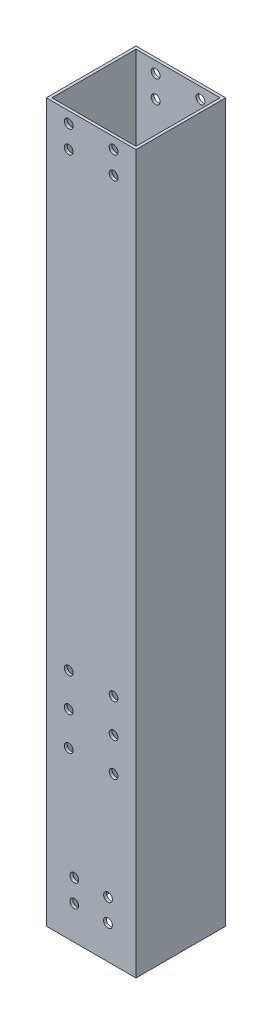
ISO-10303-21;
HEADER;
FILE_DESCRIPTION(('STEP AP214'),'2;1');
FILE_NAME('part.step','',(''),(''),'','','');
FILE_SCHEMA(('AUTOMOTIVE_DESIGN { 1 0 10303 214 1 1 1 1 }'));
ENDSEC;
DATA;
#1=APPLICATION_CONTEXT('core data for automotive mechanical design processes');
#2=APPLICATION_PROTOCOL_DEFINITION('international standard','automotive_design',2000,#1);
#3=PRODUCT_CONTEXT('',#1,'mechanical');
#4=PRODUCT('Part','Part','',(#3));
#5=PRODUCT_RELATED_PRODUCT_CATEGORY('part','',(#4));
#6=PRODUCT_DEFINITION_FORMATION('','',#4);
#7=PRODUCT_DEFINITION_CONTEXT('part definition',#1,'design');
#8=PRODUCT_DEFINITION('design','',#6,#7);
#9=PRODUCT_DEFINITION_SHAPE('','',#8);
#10=(LENGTH_UNIT() NAMED_UNIT(*) SI_UNIT(.MILLI.,.METRE.));
#11=(NAMED_UNIT(*) PLANE_ANGLE_UNIT() SI_UNIT($,.RADIAN.));
#12=(NAMED_UNIT(*) SI_UNIT($,.STERADIAN.) SOLID_ANGLE_UNIT());
#13=UNCERTAINTY_MEASURE_WITH_UNIT(LENGTH_MEASURE(1.E-05),#10,'distance_accuracy_value','');
#14=(GEOMETRIC_REPRESENTATION_CONTEXT(3) GLOBAL_UNCERTAINTY_ASSIGNED_CONTEXT((#13)) GLOBAL_UNIT_ASSIGNED_CONTEXT((#10,
#11,#12)) REPRESENTATION_CONTEXT('',''));
#15=CARTESIAN_POINT('',(0.,0.,0.));
#16=DIRECTION('',(0.,0.,1.));
#17=DIRECTION('',(1.,0.,0.));
#18=AXIS2_PLACEMENT_3D('',#15,#16,#17);
#19=CARTESIAN_POINT('',(0.,406.4,0.));
#20=DIRECTION('',(0.,-1.,0.));
#21=DIRECTION('',(0.,0.,-1.));
#22=AXIS2_PLACEMENT_3D('',#19,#20,#21);
#23=PLANE('',#22);
#24=DIRECTION('',(0.,0.,1.));
#25=VECTOR('',#24,1.);
#26=CARTESIAN_POINT('',(0.,406.4,0.));
#27=LINE('',#26,#25);
#28=CARTESIAN_POINT('',(0.,406.4,-50.8));
#29=VERTEX_POINT('',#28);
#30=CARTESIAN_POINT('',(0.,406.4,0.));
#31=VERTEX_POINT('',#30);
#32=EDGE_CURVE('E137',#29,#31,#27,.T.);
#33=ORIENTED_EDGE('',*,*,#32,.T.);
#34=DIRECTION('',(1.,0.,0.));
#35=VECTOR('',#34,1.);
#36=CARTESIAN_POINT('',(0.,406.4,0.));
#37=LINE('',#36,#35);
#38=CARTESIAN_POINT('',(50.8,406.4,0.));
#39=VERTEX_POINT('',#38);
#40=EDGE_CURVE('E140',#31,#39,#37,.T.);
#41=ORIENTED_EDGE('',*,*,#40,.T.);
#42=DIRECTION('',(0.,0.,-1.));
#43=VECTOR('',#42,1.);
#44=CARTESIAN_POINT('',(50.8,406.4,0.));
#45=LINE('',#44,#43);
#46=CARTESIAN_POINT('',(50.8,406.4,-50.8));
#47=VERTEX_POINT('',#46);
#48=EDGE_CURVE('E143',#39,#47,#45,.T.);
#49=ORIENTED_EDGE('',*,*,#48,.T.);
#50=DIRECTION('',(-1.,0.,0.));
#51=VECTOR('',#50,1.);
#52=CARTESIAN_POINT('',(0.,406.4,-50.8));
#53=LINE('',#52,#51);
#54=EDGE_CURVE('E145',#47,#29,#53,.T.);
#55=ORIENTED_EDGE('',*,*,#54,.T.);
#56=EDGE_LOOP('',(#33,#41,#49,#55));
#57=FACE_BOUND('',#56,.T.);
#58=DIRECTION('',(0.,0.,1.));
#59=VECTOR('',#58,1.);
#60=CARTESIAN_POINT('',(1.5875,406.4,0.));
#61=LINE('',#60,#59);
#62=CARTESIAN_POINT('',(1.5875,406.4,-49.2125));
#63=VERTEX_POINT('',#62);
#64=CARTESIAN_POINT('',(1.5875,406.4,-1.5875));
#65=VERTEX_POINT('',#64);
#66=EDGE_CURVE('E125',#63,#65,#61,.T.);
#67=ORIENTED_EDGE('',*,*,#66,.F.);
#68=DIRECTION('',(-1.,0.,0.));
#69=VECTOR('',#68,1.);
#70=CARTESIAN_POINT('',(0.,406.4,-49.2125));
#71=LINE('',#70,#69);
#72=CARTESIAN_POINT('',(49.2125,406.4,-49.2125));
#73=VERTEX_POINT('',#72);
#74=EDGE_CURVE('E109',#73,#63,#71,.T.);
#75=ORIENTED_EDGE('',*,*,#74,.F.);
#76=DIRECTION('',(0.,0.,-1.));
#77=VECTOR('',#76,1.);
#78=CARTESIAN_POINT('',(49.2125,406.4,0.));
#79=LINE('',#78,#77);
#80=CARTESIAN_POINT('',(49.2125,406.4,-1.5875));
#81=VERTEX_POINT('',#80);
#82=EDGE_CURVE('E134',#81,#73,#79,.T.);
#83=ORIENTED_EDGE('',*,*,#82,.F.);
#84=DIRECTION('',(1.,0.,0.));
#85=VECTOR('',#84,1.);
#86=CARTESIAN_POINT('',(0.,406.4,-1.5875));
#87=LINE('',#86,#85);
#88=EDGE_CURVE('E127',#65,#81,#87,.T.);
#89=ORIENTED_EDGE('',*,*,#88,.F.);
#90=EDGE_LOOP('',(#67,#75,#83,#89));
#91=FACE_BOUND('',#90,.T.);
#92=ADVANCED_FACE('F37',(#57,#91),#23,.F.);
#93=CARTESIAN_POINT('',(0.,0.,0.));
#94=DIRECTION('',(0.,-1.,0.));
#95=DIRECTION('',(0.,0.,-1.));
#96=AXIS2_PLACEMENT_3D('',#93,#94,#95);
#97=PLANE('',#96);
#98=DIRECTION('',(0.,0.,1.));
#99=VECTOR('',#98,1.);
#100=CARTESIAN_POINT('',(0.,0.,0.));
#101=LINE('',#100,#99);
#102=CARTESIAN_POINT('',(0.,0.,-50.8));
#103=VERTEX_POINT('',#102);
#104=CARTESIAN_POINT('',(0.,0.,0.));
#105=VERTEX_POINT('',#104);
#106=EDGE_CURVE('E148',#103,#105,#101,.T.);
#107=ORIENTED_EDGE('',*,*,#106,.F.);
#108=DIRECTION('',(-1.,0.,0.));
#109=VECTOR('',#108,1.);
#110=CARTESIAN_POINT('',(0.,0.,-50.8));
#111=LINE('',#110,#109);
#112=CARTESIAN_POINT('',(50.8,0.,-50.8));
#113=VERTEX_POINT('',#112);
#114=EDGE_CURVE('E141',#113,#103,#111,.T.);
#115=ORIENTED_EDGE('',*,*,#114,.F.);
#116=DIRECTION('',(0.,0.,-1.));
#117=VECTOR('',#116,1.);
#118=CARTESIAN_POINT('',(50.8,0.,0.));
#119=LINE('',#118,#117);
#120=CARTESIAN_POINT('',(50.8,0.,0.));
#121=VERTEX_POINT('',#120);
#122=EDGE_CURVE('E153',#121,#113,#119,.T.);
#123=ORIENTED_EDGE('',*,*,#122,.F.);
#124=DIRECTION('',(1.,0.,0.));
#125=VECTOR('',#124,1.);
#126=CARTESIAN_POINT('',(0.,0.,0.));
#127=LINE('',#126,#125);
#128=EDGE_CURVE('E151',#105,#121,#127,.T.);
#129=ORIENTED_EDGE('',*,*,#128,.F.);
#130=EDGE_LOOP('',(#107,#115,#123,#129));
#131=FACE_BOUND('',#130,.T.);
#132=DIRECTION('',(-1.,0.,0.));
#133=VECTOR('',#132,1.);
#134=CARTESIAN_POINT('',(0.,0.,-49.2125));
#135=LINE('',#134,#133);
#136=CARTESIAN_POINT('',(49.2125,0.,-49.2125));
#137=VERTEX_POINT('',#136);
#138=CARTESIAN_POINT('',(1.5875,0.,-49.2125));
#139=VERTEX_POINT('',#138);
#140=EDGE_CURVE('E107',#137,#139,#135,.T.);
#141=ORIENTED_EDGE('',*,*,#140,.T.);
#142=DIRECTION('',(0.,0.,1.));
#143=VECTOR('',#142,1.);
#144=CARTESIAN_POINT('',(1.5875,0.,0.));
#145=LINE('',#144,#143);
#146=CARTESIAN_POINT('',(1.5875,0.,-1.5875));
#147=VERTEX_POINT('',#146);
#148=EDGE_CURVE('E115',#139,#147,#145,.T.);
#149=ORIENTED_EDGE('',*,*,#148,.T.);
#150=DIRECTION('',(1.,0.,0.));
#151=VECTOR('',#150,1.);
#152=CARTESIAN_POINT('',(0.,0.,-1.5875));
#153=LINE('',#152,#151);
#154=CARTESIAN_POINT('',(49.2125,0.,-1.5875));
#155=VERTEX_POINT('',#154);
#156=EDGE_CURVE('E121',#147,#155,#153,.T.);
#157=ORIENTED_EDGE('',*,*,#156,.T.);
#158=DIRECTION('',(0.,0.,-1.));
#159=VECTOR('',#158,1.);
#160=CARTESIAN_POINT('',(49.2125,0.,0.));
#161=LINE('',#160,#159);
#162=EDGE_CURVE('E61',#155,#137,#161,.T.);
#163=ORIENTED_EDGE('',*,*,#162,.T.);
#164=EDGE_LOOP('',(#141,#149,#157,#163));
#165=FACE_BOUND('',#164,.T.);
#166=ADVANCED_FACE('F124',(#131,#165),#97,.T.);
#167=CARTESIAN_POINT('',(0.,406.4,0.));
#168=DIRECTION('',(1.,0.,0.));
#169=DIRECTION('',(0.,0.,-1.));
#170=AXIS2_PLACEMENT_3D('',#167,#168,#169);
#171=PLANE('',#170);
#172=ORIENTED_EDGE('',*,*,#106,.T.);
#173=DIRECTION('',(0.,-1.,0.));
#174=VECTOR('',#173,1.);
#175=CARTESIAN_POINT('',(0.,406.4,0.));
#176=LINE('',#175,#174);
#177=EDGE_CURVE('E11',#31,#105,#176,.T.);
#178=ORIENTED_EDGE('',*,*,#177,.F.);
#179=ORIENTED_EDGE('',*,*,#32,.F.);
#180=DIRECTION('',(0.,-1.,0.));
#181=VECTOR('',#180,1.);
#182=CARTESIAN_POINT('',(0.,406.4,-50.8));
#183=LINE('',#182,#181);
#184=EDGE_CURVE('E147',#29,#103,#183,.T.);
#185=ORIENTED_EDGE('',*,*,#184,.T.);
#186=EDGE_LOOP('',(#172,#178,#179,#185));
#187=FACE_BOUND('',#186,.T.);
#188=ADVANCED_FACE('F39',(#187),#171,.F.);
#189=CARTESIAN_POINT('',(0.,406.4,0.));
#190=DIRECTION('',(0.,0.,-1.));
#191=DIRECTION('',(-1.,0.,0.));
#192=AXIS2_PLACEMENT_3D('',#189,#190,#191);
#193=PLANE('',#192);
#194=CARTESIAN_POINT('',(12.7,131.857132766768,0.));
#195=DIRECTION('',(0.,0.,1.));
#196=DIRECTION('',(1.,0.,0.));
#197=AXIS2_PLACEMENT_3D('',#194,#195,#196);
#198=CIRCLE('',#197,2.48920000000002);
#199=CARTESIAN_POINT('',(15.1892,131.857132766768,0.));
#200=VERTEX_POINT('',#199);
#201=EDGE_CURVE('E233',#200,#200,#198,.T.);
#202=ORIENTED_EDGE('',*,*,#201,.F.);
#203=EDGE_LOOP('',(#202));
#204=FACE_BOUND('',#203,.T.);
#205=CARTESIAN_POINT('',(34.925,19.05,0.));
#206=DIRECTION('',(0.,0.,1.));
#207=DIRECTION('',(1.,0.,0.));
#208=AXIS2_PLACEMENT_3D('',#205,#206,#207);
#209=CIRCLE('',#208,2.4892);
#210=CARTESIAN_POINT('',(37.4142,19.05,0.));
#211=VERTEX_POINT('',#210);
#212=EDGE_CURVE('E237',#211,#211,#209,.T.);
#213=ORIENTED_EDGE('',*,*,#212,.F.);
#214=EDGE_LOOP('',(#213));
#215=FACE_BOUND('',#214,.T.);
#216=CARTESIAN_POINT('',(34.925,31.75,0.));
#217=DIRECTION('',(0.,0.,1.));
#218=DIRECTION('',(1.,0.,0.));
#219=AXIS2_PLACEMENT_3D('',#216,#217,#218);
#220=CIRCLE('',#219,2.4892);
#221=CARTESIAN_POINT('',(37.4142,31.75,0.));
#222=VERTEX_POINT('',#221);
#223=EDGE_CURVE('E241',#222,#222,#220,.T.);
#224=ORIENTED_EDGE('',*,*,#223,.F.);
#225=EDGE_LOOP('',(#224));
#226=FACE_BOUND('',#225,.T.);
#227=CARTESIAN_POINT('',(15.875,31.75,0.));
#228=DIRECTION('',(0.,0.,1.));
#229=DIRECTION('',(1.,0.,0.));
#230=AXIS2_PLACEMENT_3D('',#227,#228,#229);
#231=CIRCLE('',#230,2.4892);
#232=CARTESIAN_POINT('',(18.3642,31.75,0.));
#233=VERTEX_POINT('',#232);
#234=EDGE_CURVE('E245',#233,#233,#231,.T.);
#235=ORIENTED_EDGE('',*,*,#234,.F.);
#236=EDGE_LOOP('',(#235));
#237=FACE_BOUND('',#236,.T.);
#238=CARTESIAN_POINT('',(38.1,131.857132766768,0.));
#239=DIRECTION('',(0.,0.,1.));
#240=DIRECTION('',(1.,0.,0.));
#241=AXIS2_PLACEMENT_3D('',#238,#239,#240);
#242=CIRCLE('',#241,2.4892);
#243=CARTESIAN_POINT('',(40.5892,131.857132766768,0.));
#244=VERTEX_POINT('',#243);
#245=EDGE_CURVE('E249',#244,#244,#242,.T.);
#246=ORIENTED_EDGE('',*,*,#245,.F.);
#247=EDGE_LOOP('',(#246));
#248=FACE_BOUND('',#247,.T.);
#249=CARTESIAN_POINT('',(38.1,112.807132766768,0.));
#250=DIRECTION('',(0.,0.,1.));
#251=DIRECTION('',(1.,0.,0.));
#252=AXIS2_PLACEMENT_3D('',#249,#250,#251);
#253=CIRCLE('',#252,2.4892);
#254=CARTESIAN_POINT('',(40.5892,112.807132766768,0.));
#255=VERTEX_POINT('',#254);
#256=EDGE_CURVE('E253',#255,#255,#253,.T.);
#257=ORIENTED_EDGE('',*,*,#256,.F.);
#258=EDGE_LOOP('',(#257));
#259=FACE_BOUND('',#258,.T.);
#260=CARTESIAN_POINT('',(38.1,93.757132766768,0.));
#261=DIRECTION('',(0.,0.,1.));
#262=DIRECTION('',(1.,0.,0.));
#263=AXIS2_PLACEMENT_3D('',#260,#261,#262);
#264=CIRCLE('',#263,2.4892);
#265=CARTESIAN_POINT('',(40.5892,93.757132766768,0.));
#266=VERTEX_POINT('',#265);
#267=EDGE_CURVE('E257',#266,#266,#264,.T.);
#268=ORIENTED_EDGE('',*,*,#267,.F.);
#269=EDGE_LOOP('',(#268));
#270=FACE_BOUND('',#269,.T.);
#271=CARTESIAN_POINT('',(12.7,93.757132766768,0.));
#272=DIRECTION('',(0.,0.,1.));
#273=DIRECTION('',(1.,0.,0.));
#274=AXIS2_PLACEMENT_3D('',#271,#272,#273);
#275=CIRCLE('',#274,2.48919999999999);
#276=CARTESIAN_POINT('',(15.1892,93.757132766768,0.));
#277=VERTEX_POINT('',#276);
#278=EDGE_CURVE('E261',#277,#277,#275,.T.);
#279=ORIENTED_EDGE('',*,*,#278,.F.);
#280=EDGE_LOOP('',(#279));
#281=FACE_BOUND('',#280,.T.);
#282=CARTESIAN_POINT('',(15.875,19.05,0.));
#283=DIRECTION('',(0.,0.,1.));
#284=DIRECTION('',(1.,0.,0.));
#285=AXIS2_PLACEMENT_3D('',#282,#283,#284);
#286=CIRCLE('',#285,2.4892);
#287=CARTESIAN_POINT('',(18.3642,19.05,0.));
#288=VERTEX_POINT('',#287);
#289=EDGE_CURVE('E265',#288,#288,#286,.T.);
#290=ORIENTED_EDGE('',*,*,#289,.F.);
#291=EDGE_LOOP('',(#290));
#292=FACE_BOUND('',#291,.T.);
#293=CARTESIAN_POINT('',(12.7,112.807132766768,0.));
#294=DIRECTION('',(0.,0.,1.));
#295=DIRECTION('',(1.,0.,0.));
#296=AXIS2_PLACEMENT_3D('',#293,#294,#295);
#297=CIRCLE('',#296,2.48919999999999);
#298=CARTESIAN_POINT('',(15.1892,112.807132766768,0.));
#299=VERTEX_POINT('',#298);
#300=EDGE_CURVE('E269',#299,#299,#297,.T.);
#301=ORIENTED_EDGE('',*,*,#300,.F.);
#302=EDGE_LOOP('',(#301));
#303=FACE_BOUND('',#302,.T.);
#304=CARTESIAN_POINT('',(12.7,400.05,0.));
#305=DIRECTION('',(0.,0.,1.));
#306=DIRECTION('',(1.,0.,0.));
#307=AXIS2_PLACEMENT_3D('',#304,#305,#306);
#308=CIRCLE('',#307,2.4892);
#309=CARTESIAN_POINT('',(15.1892,400.05,0.));
#310=VERTEX_POINT('',#309);
#311=EDGE_CURVE('E273',#310,#310,#308,.T.);
#312=ORIENTED_EDGE('',*,*,#311,.F.);
#313=EDGE_LOOP('',(#312));
#314=FACE_BOUND('',#313,.T.);
#315=CARTESIAN_POINT('',(38.1,400.05,0.));
#316=DIRECTION('',(0.,0.,1.));
#317=DIRECTION('',(1.,0.,0.));
#318=AXIS2_PLACEMENT_3D('',#315,#316,#317);
#319=CIRCLE('',#318,2.48919999999999);
#320=CARTESIAN_POINT('',(40.5892,400.05,0.));
#321=VERTEX_POINT('',#320);
#322=EDGE_CURVE('E277',#321,#321,#319,.T.);
#323=ORIENTED_EDGE('',*,*,#322,.F.);
#324=EDGE_LOOP('',(#323));
#325=FACE_BOUND('',#324,.T.);
#326=CARTESIAN_POINT('',(38.1,387.35,0.));
#327=DIRECTION('',(0.,0.,1.));
#328=DIRECTION('',(1.,0.,0.));
#329=AXIS2_PLACEMENT_3D('',#326,#327,#328);
#330=CIRCLE('',#329,2.4892);
#331=CARTESIAN_POINT('',(40.5892,387.35,0.));
#332=VERTEX_POINT('',#331);
#333=EDGE_CURVE('E281',#332,#332,#330,.T.);
#334=ORIENTED_EDGE('',*,*,#333,.F.);
#335=EDGE_LOOP('',(#334));
#336=FACE_BOUND('',#335,.T.);
#337=CARTESIAN_POINT('',(12.7,387.35,0.));
#338=DIRECTION('',(0.,0.,1.));
#339=DIRECTION('',(1.,0.,0.));
#340=AXIS2_PLACEMENT_3D('',#337,#338,#339);
#341=CIRCLE('',#340,2.48920000000001);
#342=CARTESIAN_POINT('',(15.1892,387.35,0.));
#343=VERTEX_POINT('',#342);
#344=EDGE_CURVE('E285',#343,#343,#341,.T.);
#345=ORIENTED_EDGE('',*,*,#344,.F.);
#346=EDGE_LOOP('',(#345));
#347=FACE_BOUND('',#346,.T.);
#348=ORIENTED_EDGE('',*,*,#128,.T.);
#349=DIRECTION('',(0.,-1.,0.));
#350=VECTOR('',#349,1.);
#351=CARTESIAN_POINT('',(50.8,406.4,0.));
#352=LINE('',#351,#350);
#353=EDGE_CURVE('E46',#39,#121,#352,.T.);
#354=ORIENTED_EDGE('',*,*,#353,.F.);
#355=ORIENTED_EDGE('',*,*,#40,.F.);
#356=ORIENTED_EDGE('',*,*,#177,.T.);
#357=EDGE_LOOP('',(#348,#354,#355,#356));
#358=FACE_BOUND('',#357,.T.);
#359=ADVANCED_FACE('F222',(#204,#215,#226,#237,#248,#259,#270,#281,#292,#303,#314,#325,#336,
#347,#358),#193,.F.);
#360=CARTESIAN_POINT('',(50.8,406.4,0.));
#361=DIRECTION('',(-1.,0.,0.));
#362=DIRECTION('',(0.,0.,1.));
#363=AXIS2_PLACEMENT_3D('',#360,#361,#362);
#364=PLANE('',#363);
#365=ORIENTED_EDGE('',*,*,#122,.T.);
#366=DIRECTION('',(0.,-1.,0.));
#367=VECTOR('',#366,1.);
#368=CARTESIAN_POINT('',(50.8,406.4,-50.8));
#369=LINE('',#368,#367);
#370=EDGE_CURVE('E158',#47,#113,#369,.T.);
#371=ORIENTED_EDGE('',*,*,#370,.F.);
#372=ORIENTED_EDGE('',*,*,#48,.F.);
#373=ORIENTED_EDGE('',*,*,#353,.T.);
#374=EDGE_LOOP('',(#365,#371,#372,#373));
#375=FACE_BOUND('',#374,.T.);
#376=ADVANCED_FACE('F219',(#375),#364,.F.);
#377=CARTESIAN_POINT('',(0.,406.4,-50.8));
#378=DIRECTION('',(0.,0.,1.));
#379=DIRECTION('',(1.,0.,0.));
#380=AXIS2_PLACEMENT_3D('',#377,#378,#379);
#381=PLANE('',#380);
#382=CARTESIAN_POINT('',(12.7,400.05,-50.8));
#383=DIRECTION('',(0.,0.,1.));
#384=DIRECTION('',(1.,0.,0.));
#385=AXIS2_PLACEMENT_3D('',#382,#383,#384);
#386=CIRCLE('',#385,2.4892);
#387=CARTESIAN_POINT('',(15.1892,400.05,-50.8));
#388=VERTEX_POINT('',#387);
#389=EDGE_CURVE('E303',#388,#388,#386,.T.);
#390=ORIENTED_EDGE('',*,*,#389,.T.);
#391=EDGE_LOOP('',(#390));
#392=FACE_BOUND('',#391,.T.);
#393=CARTESIAN_POINT('',(38.1,400.05,-50.8));
#394=DIRECTION('',(0.,0.,1.));
#395=DIRECTION('',(1.,0.,0.));
#396=AXIS2_PLACEMENT_3D('',#393,#394,#395);
#397=CIRCLE('',#396,2.48919999999999);
#398=CARTESIAN_POINT('',(40.5892,400.05,-50.8));
#399=VERTEX_POINT('',#398);
#400=EDGE_CURVE('E308',#399,#399,#397,.T.);
#401=ORIENTED_EDGE('',*,*,#400,.T.);
#402=EDGE_LOOP('',(#401));
#403=FACE_BOUND('',#402,.T.);
#404=CARTESIAN_POINT('',(38.1,387.35,-50.8));
#405=DIRECTION('',(0.,0.,1.));
#406=DIRECTION('',(1.,0.,0.));
#407=AXIS2_PLACEMENT_3D('',#404,#405,#406);
#408=CIRCLE('',#407,2.4892);
#409=CARTESIAN_POINT('',(40.5892,387.35,-50.8));
#410=VERTEX_POINT('',#409);
#411=EDGE_CURVE('E300',#410,#410,#408,.T.);
#412=ORIENTED_EDGE('',*,*,#411,.T.);
#413=EDGE_LOOP('',(#412));
#414=FACE_BOUND('',#413,.T.);
#415=CARTESIAN_POINT('',(12.7,387.35,-50.8));
#416=DIRECTION('',(0.,0.,1.));
#417=DIRECTION('',(1.,0.,0.));
#418=AXIS2_PLACEMENT_3D('',#415,#416,#417);
#419=CIRCLE('',#418,2.48920000000001);
#420=CARTESIAN_POINT('',(15.1892,387.35,-50.8));
#421=VERTEX_POINT('',#420);
#422=EDGE_CURVE('E167',#421,#421,#419,.T.);
#423=ORIENTED_EDGE('',*,*,#422,.T.);
#424=EDGE_LOOP('',(#423));
#425=FACE_BOUND('',#424,.T.);
#426=ORIENTED_EDGE('',*,*,#114,.T.);
#427=ORIENTED_EDGE('',*,*,#184,.F.);
#428=ORIENTED_EDGE('',*,*,#54,.F.);
#429=ORIENTED_EDGE('',*,*,#370,.T.);
#430=EDGE_LOOP('',(#426,#427,#428,#429));
#431=FACE_BOUND('',#430,.T.);
#432=ADVANCED_FACE('F203',(#392,#403,#414,#425,#431),#381,.F.);
#433=CARTESIAN_POINT('',(1.5875,406.4,0.));
#434=DIRECTION('',(1.,0.,0.));
#435=DIRECTION('',(0.,0.,-1.));
#436=AXIS2_PLACEMENT_3D('',#433,#434,#435);
#437=PLANE('',#436);
#438=ORIENTED_EDGE('',*,*,#148,.F.);
#439=DIRECTION('',(0.,-1.,0.));
#440=VECTOR('',#439,1.);
#441=CARTESIAN_POINT('',(1.5875,406.4,-49.2125));
#442=LINE('',#441,#440);
#443=EDGE_CURVE('E103',#63,#139,#442,.T.);
#444=ORIENTED_EDGE('',*,*,#443,.F.);
#445=ORIENTED_EDGE('',*,*,#66,.T.);
#446=DIRECTION('',(0.,-1.,0.));
#447=VECTOR('',#446,1.);
#448=CARTESIAN_POINT('',(1.5875,406.4,-1.5875));
#449=LINE('',#448,#447);
#450=EDGE_CURVE('E118',#65,#147,#449,.T.);
#451=ORIENTED_EDGE('',*,*,#450,.T.);
#452=EDGE_LOOP('',(#438,#444,#445,#451));
#453=FACE_BOUND('',#452,.T.);
#454=ADVANCED_FACE('F116',(#453),#437,.T.);
#455=CARTESIAN_POINT('',(0.,406.4,-1.5875));
#456=DIRECTION('',(0.,0.,-1.));
#457=DIRECTION('',(-1.,0.,0.));
#458=AXIS2_PLACEMENT_3D('',#455,#456,#457);
#459=PLANE('',#458);
#460=CARTESIAN_POINT('',(12.7,131.857132766768,-1.5875));
#461=DIRECTION('',(0.,0.,1.));
#462=DIRECTION('',(1.,0.,0.));
#463=AXIS2_PLACEMENT_3D('',#460,#461,#462);
#464=CIRCLE('',#463,2.48920000000002);
#465=CARTESIAN_POINT('',(15.1892,131.857132766768,-1.5875));
#466=VERTEX_POINT('',#465);
#467=EDGE_CURVE('E337',#466,#466,#464,.T.);
#468=ORIENTED_EDGE('',*,*,#467,.T.);
#469=EDGE_LOOP('',(#468));
#470=FACE_BOUND('',#469,.T.);
#471=CARTESIAN_POINT('',(34.925,19.05,-1.5875));
#472=DIRECTION('',(0.,0.,1.));
#473=DIRECTION('',(1.,0.,0.));
#474=AXIS2_PLACEMENT_3D('',#471,#472,#473);
#475=CIRCLE('',#474,2.4892);
#476=CARTESIAN_POINT('',(37.4142,19.05,-1.5875));
#477=VERTEX_POINT('',#476);
#478=EDGE_CURVE('E333',#477,#477,#475,.T.);
#479=ORIENTED_EDGE('',*,*,#478,.T.);
#480=EDGE_LOOP('',(#479));
#481=FACE_BOUND('',#480,.T.);
#482=CARTESIAN_POINT('',(34.925,31.75,-1.5875));
#483=DIRECTION('',(0.,0.,1.));
#484=DIRECTION('',(1.,0.,0.));
#485=AXIS2_PLACEMENT_3D('',#482,#483,#484);
#486=CIRCLE('',#485,2.4892);
#487=CARTESIAN_POINT('',(37.4142,31.75,-1.5875));
#488=VERTEX_POINT('',#487);
#489=EDGE_CURVE('E344',#488,#488,#486,.T.);
#490=ORIENTED_EDGE('',*,*,#489,.T.);
#491=EDGE_LOOP('',(#490));
#492=FACE_BOUND('',#491,.T.);
#493=CARTESIAN_POINT('',(15.875,31.75,-1.5875));
#494=DIRECTION('',(0.,0.,1.));
#495=DIRECTION('',(1.,0.,0.));
#496=AXIS2_PLACEMENT_3D('',#493,#494,#495);
#497=CIRCLE('',#496,2.4892);
#498=CARTESIAN_POINT('',(18.3642,31.75,-1.5875));
#499=VERTEX_POINT('',#498);
#500=EDGE_CURVE('E340',#499,#499,#497,.T.);
#501=ORIENTED_EDGE('',*,*,#500,.T.);
#502=EDGE_LOOP('',(#501));
#503=FACE_BOUND('',#502,.T.);
#504=CARTESIAN_POINT('',(38.1,131.857132766768,-1.5875));
#505=DIRECTION('',(0.,0.,1.));
#506=DIRECTION('',(1.,0.,0.));
#507=AXIS2_PLACEMENT_3D('',#504,#505,#506);
#508=CIRCLE('',#507,2.4892);
#509=CARTESIAN_POINT('',(40.5892,131.857132766768,-1.5875));
#510=VERTEX_POINT('',#509);
#511=EDGE_CURVE('E317',#510,#510,#508,.T.);
#512=ORIENTED_EDGE('',*,*,#511,.T.);
#513=EDGE_LOOP('',(#512));
#514=FACE_BOUND('',#513,.T.);
#515=CARTESIAN_POINT('',(38.1,112.807132766768,-1.5875));
#516=DIRECTION('',(0.,0.,1.));
#517=DIRECTION('',(1.,0.,0.));
#518=AXIS2_PLACEMENT_3D('',#515,#516,#517);
#519=CIRCLE('',#518,2.4892);
#520=CARTESIAN_POINT('',(40.5892,112.807132766768,-1.5875));
#521=VERTEX_POINT('',#520);
#522=EDGE_CURVE('E321',#521,#521,#519,.T.);
#523=ORIENTED_EDGE('',*,*,#522,.T.);
#524=EDGE_LOOP('',(#523));
#525=FACE_BOUND('',#524,.T.);
#526=CARTESIAN_POINT('',(38.1,93.757132766768,-1.5875));
#527=DIRECTION('',(0.,0.,1.));
#528=DIRECTION('',(1.,0.,0.));
#529=AXIS2_PLACEMENT_3D('',#526,#527,#528);
#530=CIRCLE('',#529,2.4892);
#531=CARTESIAN_POINT('',(40.5892,93.757132766768,-1.5875));
#532=VERTEX_POINT('',#531);
#533=EDGE_CURVE('E325',#532,#532,#530,.T.);
#534=ORIENTED_EDGE('',*,*,#533,.T.);
#535=EDGE_LOOP('',(#534));
#536=FACE_BOUND('',#535,.T.);
#537=CARTESIAN_POINT('',(12.7,93.757132766768,-1.5875));
#538=DIRECTION('',(0.,0.,1.));
#539=DIRECTION('',(1.,0.,0.));
#540=AXIS2_PLACEMENT_3D('',#537,#538,#539);
#541=CIRCLE('',#540,2.48919999999999);
#542=CARTESIAN_POINT('',(15.1892,93.757132766768,-1.5875));
#543=VERTEX_POINT('',#542);
#544=EDGE_CURVE('E329',#543,#543,#541,.T.);
#545=ORIENTED_EDGE('',*,*,#544,.T.);
#546=EDGE_LOOP('',(#545));
#547=FACE_BOUND('',#546,.T.);
#548=CARTESIAN_POINT('',(15.875,19.05,-1.5875));
#549=DIRECTION('',(0.,0.,1.));
#550=DIRECTION('',(1.,0.,0.));
#551=AXIS2_PLACEMENT_3D('',#548,#549,#550);
#552=CIRCLE('',#551,2.4892);
#553=CARTESIAN_POINT('',(18.3642,19.05,-1.5875));
#554=VERTEX_POINT('',#553);
#555=EDGE_CURVE('E348',#554,#554,#552,.T.);
#556=ORIENTED_EDGE('',*,*,#555,.T.);
#557=EDGE_LOOP('',(#556));
#558=FACE_BOUND('',#557,.T.);
#559=CARTESIAN_POINT('',(12.7,112.807132766768,-1.5875));
#560=DIRECTION('',(0.,0.,1.));
#561=DIRECTION('',(1.,0.,0.));
#562=AXIS2_PLACEMENT_3D('',#559,#560,#561);
#563=CIRCLE('',#562,2.48919999999999);
#564=CARTESIAN_POINT('',(15.1892,112.807132766768,-1.5875));
#565=VERTEX_POINT('',#564);
#566=EDGE_CURVE('E306',#565,#565,#563,.T.);
#567=ORIENTED_EDGE('',*,*,#566,.T.);
#568=EDGE_LOOP('',(#567));
#569=FACE_BOUND('',#568,.T.);
#570=CARTESIAN_POINT('',(12.7,400.05,-1.5875));
#571=DIRECTION('',(0.,0.,-1.));
#572=DIRECTION('',(-1.,0.,0.));
#573=AXIS2_PLACEMENT_3D('',#570,#571,#572);
#574=CIRCLE('',#573,2.4892);
#575=CARTESIAN_POINT('',(10.2108,400.05,-1.5875));
#576=VERTEX_POINT('',#575);
#577=EDGE_CURVE('E122',#576,#576,#574,.T.);
#578=ORIENTED_EDGE('',*,*,#577,.F.);
#579=EDGE_LOOP('',(#578));
#580=FACE_BOUND('',#579,.T.);
#581=CARTESIAN_POINT('',(38.1,400.05,-1.5875));
#582=DIRECTION('',(0.,0.,-1.));
#583=DIRECTION('',(-1.,0.,0.));
#584=AXIS2_PLACEMENT_3D('',#581,#582,#583);
#585=CIRCLE('',#584,2.48919999999999);
#586=CARTESIAN_POINT('',(35.6108,400.05,-1.5875));
#587=VERTEX_POINT('',#586);
#588=EDGE_CURVE('E173',#587,#587,#585,.T.);
#589=ORIENTED_EDGE('',*,*,#588,.F.);
#590=EDGE_LOOP('',(#589));
#591=FACE_BOUND('',#590,.T.);
#592=CARTESIAN_POINT('',(38.1,387.35,-1.5875));
#593=DIRECTION('',(0.,0.,-1.));
#594=DIRECTION('',(-1.,0.,0.));
#595=AXIS2_PLACEMENT_3D('',#592,#593,#594);
#596=CIRCLE('',#595,2.4892);
#597=CARTESIAN_POINT('',(35.6108,387.35,-1.5875));
#598=VERTEX_POINT('',#597);
#599=EDGE_CURVE('E170',#598,#598,#596,.T.);
#600=ORIENTED_EDGE('',*,*,#599,.F.);
#601=EDGE_LOOP('',(#600));
#602=FACE_BOUND('',#601,.T.);
#603=CARTESIAN_POINT('',(12.7,387.35,-1.5875));
#604=DIRECTION('',(0.,0.,-1.));
#605=DIRECTION('',(-1.,0.,0.));
#606=AXIS2_PLACEMENT_3D('',#603,#604,#605);
#607=CIRCLE('',#606,2.48920000000001);
#608=CARTESIAN_POINT('',(10.2108,387.35,-1.5875));
#609=VERTEX_POINT('',#608);
#610=EDGE_CURVE('E166',#609,#609,#607,.T.);
#611=ORIENTED_EDGE('',*,*,#610,.F.);
#612=EDGE_LOOP('',(#611));
#613=FACE_BOUND('',#612,.T.);
#614=ORIENTED_EDGE('',*,*,#156,.F.);
#615=ORIENTED_EDGE('',*,*,#450,.F.);
#616=ORIENTED_EDGE('',*,*,#88,.T.);
#617=DIRECTION('',(0.,-1.,0.));
#618=VECTOR('',#617,1.);
#619=CARTESIAN_POINT('',(49.2125,406.4,-1.5875));
#620=LINE('',#619,#618);
#621=EDGE_CURVE('E187',#81,#155,#620,.T.);
#622=ORIENTED_EDGE('',*,*,#621,.T.);
#623=EDGE_LOOP('',(#614,#615,#616,#622));
#624=FACE_BOUND('',#623,.T.);
#625=ADVANCED_FACE('F194',(#470,#481,#492,#503,#514,#525,#536,#547,#558,#569,#580,#591,#602,
#613,#624),#459,.T.);
#626=CARTESIAN_POINT('',(49.2125,406.4,0.));
#627=DIRECTION('',(-1.,0.,0.));
#628=DIRECTION('',(0.,0.,1.));
#629=AXIS2_PLACEMENT_3D('',#626,#627,#628);
#630=PLANE('',#629);
#631=ORIENTED_EDGE('',*,*,#162,.F.);
#632=ORIENTED_EDGE('',*,*,#621,.F.);
#633=ORIENTED_EDGE('',*,*,#82,.T.);
#634=DIRECTION('',(0.,-1.,0.));
#635=VECTOR('',#634,1.);
#636=CARTESIAN_POINT('',(49.2125,406.4,-49.2125));
#637=LINE('',#636,#635);
#638=EDGE_CURVE('E54',#73,#137,#637,.T.);
#639=ORIENTED_EDGE('',*,*,#638,.T.);
#640=EDGE_LOOP('',(#631,#632,#633,#639));
#641=FACE_BOUND('',#640,.T.);
#642=ADVANCED_FACE('F189',(#641),#630,.T.);
#643=CARTESIAN_POINT('',(0.,406.4,-49.2125));
#644=DIRECTION('',(0.,0.,1.));
#645=DIRECTION('',(1.,0.,0.));
#646=AXIS2_PLACEMENT_3D('',#643,#644,#645);
#647=PLANE('',#646);
#648=CARTESIAN_POINT('',(12.7,400.05,-49.2125));
#649=DIRECTION('',(0.,0.,1.));
#650=DIRECTION('',(1.,0.,0.));
#651=AXIS2_PLACEMENT_3D('',#648,#649,#650);
#652=CIRCLE('',#651,2.4892);
#653=CARTESIAN_POINT('',(15.1892,400.05,-49.2125));
#654=VERTEX_POINT('',#653);
#655=EDGE_CURVE('E41',#654,#654,#652,.T.);
#656=ORIENTED_EDGE('',*,*,#655,.F.);
#657=EDGE_LOOP('',(#656));
#658=FACE_BOUND('',#657,.T.);
#659=CARTESIAN_POINT('',(38.1,400.05,-49.2125));
#660=DIRECTION('',(0.,0.,1.));
#661=DIRECTION('',(1.,0.,0.));
#662=AXIS2_PLACEMENT_3D('',#659,#660,#661);
#663=CIRCLE('',#662,2.48919999999999);
#664=CARTESIAN_POINT('',(40.5892,400.05,-49.2125));
#665=VERTEX_POINT('',#664);
#666=EDGE_CURVE('E171',#665,#665,#663,.T.);
#667=ORIENTED_EDGE('',*,*,#666,.F.);
#668=EDGE_LOOP('',(#667));
#669=FACE_BOUND('',#668,.T.);
#670=CARTESIAN_POINT('',(38.1,387.35,-49.2125));
#671=DIRECTION('',(0.,0.,1.));
#672=DIRECTION('',(1.,0.,0.));
#673=AXIS2_PLACEMENT_3D('',#670,#671,#672);
#674=CIRCLE('',#673,2.4892);
#675=CARTESIAN_POINT('',(40.5892,387.35,-49.2125));
#676=VERTEX_POINT('',#675);
#677=EDGE_CURVE('E168',#676,#676,#674,.T.);
#678=ORIENTED_EDGE('',*,*,#677,.F.);
#679=EDGE_LOOP('',(#678));
#680=FACE_BOUND('',#679,.T.);
#681=CARTESIAN_POINT('',(12.7,387.35,-49.2125));
#682=DIRECTION('',(0.,0.,1.));
#683=DIRECTION('',(1.,0.,0.));
#684=AXIS2_PLACEMENT_3D('',#681,#682,#683);
#685=CIRCLE('',#684,2.48920000000001);
#686=CARTESIAN_POINT('',(15.1892,387.35,-49.2125));
#687=VERTEX_POINT('',#686);
#688=EDGE_CURVE('E163',#687,#687,#685,.T.);
#689=ORIENTED_EDGE('',*,*,#688,.F.);
#690=EDGE_LOOP('',(#689));
#691=FACE_BOUND('',#690,.T.);
#692=ORIENTED_EDGE('',*,*,#140,.F.);
#693=ORIENTED_EDGE('',*,*,#638,.F.);
#694=ORIENTED_EDGE('',*,*,#74,.T.);
#695=ORIENTED_EDGE('',*,*,#443,.T.);
#696=EDGE_LOOP('',(#692,#693,#694,#695));
#697=FACE_BOUND('',#696,.T.);
#698=ADVANCED_FACE('F105',(#658,#669,#680,#691,#697),#647,.T.);
#699=CARTESIAN_POINT('',(12.7,387.35,-50.8));
#700=DIRECTION('',(0.,0.,1.));
#701=DIRECTION('',(1.,0.,0.));
#702=AXIS2_PLACEMENT_3D('',#699,#700,#701);
#703=CYLINDRICAL_SURFACE('',#702,2.48920000000001);
#704=ORIENTED_EDGE('',*,*,#688,.T.);
#705=EDGE_LOOP('',(#704));
#706=FACE_BOUND('',#705,.T.);
#707=ORIENTED_EDGE('',*,*,#422,.F.);
#708=EDGE_LOOP('',(#707));
#709=FACE_BOUND('',#708,.T.);
#710=ADVANCED_FACE('F401',(#706,#709),#703,.F.);
#711=CARTESIAN_POINT('',(38.1,387.35,-50.8));
#712=DIRECTION('',(0.,0.,1.));
#713=DIRECTION('',(1.,0.,0.));
#714=AXIS2_PLACEMENT_3D('',#711,#712,#713);
#715=CYLINDRICAL_SURFACE('',#714,2.4892);
#716=ORIENTED_EDGE('',*,*,#677,.T.);
#717=EDGE_LOOP('',(#716));
#718=FACE_BOUND('',#717,.T.);
#719=ORIENTED_EDGE('',*,*,#411,.F.);
#720=EDGE_LOOP('',(#719));
#721=FACE_BOUND('',#720,.T.);
#722=ADVANCED_FACE('F397',(#718,#721),#715,.F.);
#723=CARTESIAN_POINT('',(38.1,400.05,-50.8));
#724=DIRECTION('',(0.,0.,1.));
#725=DIRECTION('',(1.,0.,0.));
#726=AXIS2_PLACEMENT_3D('',#723,#724,#725);
#727=CYLINDRICAL_SURFACE('',#726,2.48919999999999);
#728=ORIENTED_EDGE('',*,*,#666,.T.);
#729=EDGE_LOOP('',(#728));
#730=FACE_BOUND('',#729,.T.);
#731=ORIENTED_EDGE('',*,*,#400,.F.);
#732=EDGE_LOOP('',(#731));
#733=FACE_BOUND('',#732,.T.);
#734=ADVANCED_FACE('F400',(#730,#733),#727,.F.);
#735=CARTESIAN_POINT('',(12.7,400.05,-50.8));
#736=DIRECTION('',(0.,0.,1.));
#737=DIRECTION('',(1.,0.,0.));
#738=AXIS2_PLACEMENT_3D('',#735,#736,#737);
#739=CYLINDRICAL_SURFACE('',#738,2.4892);
#740=ORIENTED_EDGE('',*,*,#655,.T.);
#741=EDGE_LOOP('',(#740));
#742=FACE_BOUND('',#741,.T.);
#743=ORIENTED_EDGE('',*,*,#389,.F.);
#744=EDGE_LOOP('',(#743));
#745=FACE_BOUND('',#744,.T.);
#746=ADVANCED_FACE('F406',(#742,#745),#739,.F.);
#747=ORIENTED_EDGE('',*,*,#610,.T.);
#748=EDGE_LOOP('',(#747));
#749=FACE_BOUND('',#748,.T.);
#750=ORIENTED_EDGE('',*,*,#344,.T.);
#751=EDGE_LOOP('',(#750));
#752=FACE_BOUND('',#751,.T.);
#753=ADVANCED_FACE('F410',(#749,#752),#703,.F.);
#754=ORIENTED_EDGE('',*,*,#599,.T.);
#755=EDGE_LOOP('',(#754));
#756=FACE_BOUND('',#755,.T.);
#757=ORIENTED_EDGE('',*,*,#333,.T.);
#758=EDGE_LOOP('',(#757));
#759=FACE_BOUND('',#758,.T.);
#760=ADVANCED_FACE('F403',(#756,#759),#715,.F.);
#761=ORIENTED_EDGE('',*,*,#588,.T.);
#762=EDGE_LOOP('',(#761));
#763=FACE_BOUND('',#762,.T.);
#764=ORIENTED_EDGE('',*,*,#322,.T.);
#765=EDGE_LOOP('',(#764));
#766=FACE_BOUND('',#765,.T.);
#767=ADVANCED_FACE('F407',(#763,#766),#727,.F.);
#768=ORIENTED_EDGE('',*,*,#577,.T.);
#769=EDGE_LOOP('',(#768));
#770=FACE_BOUND('',#769,.T.);
#771=ORIENTED_EDGE('',*,*,#311,.T.);
#772=EDGE_LOOP('',(#771));
#773=FACE_BOUND('',#772,.T.);
#774=ADVANCED_FACE('F365',(#770,#773),#739,.F.);
#775=CARTESIAN_POINT('',(12.7,112.807132766768,-1.5875));
#776=DIRECTION('',(0.,0.,1.));
#777=DIRECTION('',(1.,0.,0.));
#778=AXIS2_PLACEMENT_3D('',#775,#776,#777);
#779=CYLINDRICAL_SURFACE('',#778,2.48919999999999);
#780=ORIENTED_EDGE('',*,*,#566,.F.);
#781=EDGE_LOOP('',(#780));
#782=FACE_BOUND('',#781,.T.);
#783=ORIENTED_EDGE('',*,*,#300,.T.);
#784=EDGE_LOOP('',(#783));
#785=FACE_BOUND('',#784,.T.);
#786=ADVANCED_FACE('F355',(#782,#785),#779,.F.);
#787=CARTESIAN_POINT('',(15.875,19.05,-1.5875));
#788=DIRECTION('',(0.,0.,1.));
#789=DIRECTION('',(1.,0.,0.));
#790=AXIS2_PLACEMENT_3D('',#787,#788,#789);
#791=CYLINDRICAL_SURFACE('',#790,2.4892);
#792=ORIENTED_EDGE('',*,*,#555,.F.);
#793=EDGE_LOOP('',(#792));
#794=FACE_BOUND('',#793,.T.);
#795=ORIENTED_EDGE('',*,*,#289,.T.);
#796=EDGE_LOOP('',(#795));
#797=FACE_BOUND('',#796,.T.);
#798=ADVANCED_FACE('F352',(#794,#797),#791,.F.);
#799=CARTESIAN_POINT('',(12.7,93.757132766768,-1.5875));
#800=DIRECTION('',(0.,0.,1.));
#801=DIRECTION('',(1.,0.,0.));
#802=AXIS2_PLACEMENT_3D('',#799,#800,#801);
#803=CYLINDRICAL_SURFACE('',#802,2.48919999999999);
#804=ORIENTED_EDGE('',*,*,#544,.F.);
#805=EDGE_LOOP('',(#804));
#806=FACE_BOUND('',#805,.T.);
#807=ORIENTED_EDGE('',*,*,#278,.T.);
#808=EDGE_LOOP('',(#807));
#809=FACE_BOUND('',#808,.T.);
#810=ADVANCED_FACE('F354',(#806,#809),#803,.F.);
#811=CARTESIAN_POINT('',(38.1,93.757132766768,-1.5875));
#812=DIRECTION('',(0.,0.,1.));
#813=DIRECTION('',(1.,0.,0.));
#814=AXIS2_PLACEMENT_3D('',#811,#812,#813);
#815=CYLINDRICAL_SURFACE('',#814,2.4892);
#816=ORIENTED_EDGE('',*,*,#533,.F.);
#817=EDGE_LOOP('',(#816));
#818=FACE_BOUND('',#817,.T.);
#819=ORIENTED_EDGE('',*,*,#267,.T.);
#820=EDGE_LOOP('',(#819));
#821=FACE_BOUND('',#820,.T.);
#822=ADVANCED_FACE('F362',(#818,#821),#815,.F.);
#823=CARTESIAN_POINT('',(38.1,112.807132766768,-1.5875));
#824=DIRECTION('',(0.,0.,1.));
#825=DIRECTION('',(1.,0.,0.));
#826=AXIS2_PLACEMENT_3D('',#823,#824,#825);
#827=CYLINDRICAL_SURFACE('',#826,2.4892);
#828=ORIENTED_EDGE('',*,*,#522,.F.);
#829=EDGE_LOOP('',(#828));
#830=FACE_BOUND('',#829,.T.);
#831=ORIENTED_EDGE('',*,*,#256,.T.);
#832=EDGE_LOOP('',(#831));
#833=FACE_BOUND('',#832,.T.);
#834=ADVANCED_FACE('F389',(#830,#833),#827,.F.);
#835=CARTESIAN_POINT('',(38.1,131.857132766768,-1.5875));
#836=DIRECTION('',(0.,0.,1.));
#837=DIRECTION('',(1.,0.,0.));
#838=AXIS2_PLACEMENT_3D('',#835,#836,#837);
#839=CYLINDRICAL_SURFACE('',#838,2.4892);
#840=ORIENTED_EDGE('',*,*,#511,.F.);
#841=EDGE_LOOP('',(#840));
#842=FACE_BOUND('',#841,.T.);
#843=ORIENTED_EDGE('',*,*,#245,.T.);
#844=EDGE_LOOP('',(#843));
#845=FACE_BOUND('',#844,.T.);
#846=ADVANCED_FACE('F378',(#842,#845),#839,.F.);
#847=CARTESIAN_POINT('',(15.875,31.75,-1.5875));
#848=DIRECTION('',(0.,0.,1.));
#849=DIRECTION('',(1.,0.,0.));
#850=AXIS2_PLACEMENT_3D('',#847,#848,#849);
#851=CYLINDRICAL_SURFACE('',#850,2.4892);
#852=ORIENTED_EDGE('',*,*,#500,.F.);
#853=EDGE_LOOP('',(#852));
#854=FACE_BOUND('',#853,.T.);
#855=ORIENTED_EDGE('',*,*,#234,.T.);
#856=EDGE_LOOP('',(#855));
#857=FACE_BOUND('',#856,.T.);
#858=ADVANCED_FACE('F374',(#854,#857),#851,.F.);
#859=CARTESIAN_POINT('',(34.925,31.75,-1.5875));
#860=DIRECTION('',(0.,0.,1.));
#861=DIRECTION('',(1.,0.,0.));
#862=AXIS2_PLACEMENT_3D('',#859,#860,#861);
#863=CYLINDRICAL_SURFACE('',#862,2.4892);
#864=ORIENTED_EDGE('',*,*,#489,.F.);
#865=EDGE_LOOP('',(#864));
#866=FACE_BOUND('',#865,.T.);
#867=ORIENTED_EDGE('',*,*,#223,.T.);
#868=EDGE_LOOP('',(#867));
#869=FACE_BOUND('',#868,.T.);
#870=ADVANCED_FACE('F370',(#866,#869),#863,.F.);
#871=CARTESIAN_POINT('',(34.925,19.05,-1.5875));
#872=DIRECTION('',(0.,0.,1.));
#873=DIRECTION('',(1.,0.,0.));
#874=AXIS2_PLACEMENT_3D('',#871,#872,#873);
#875=CYLINDRICAL_SURFACE('',#874,2.4892);
#876=ORIENTED_EDGE('',*,*,#478,.F.);
#877=EDGE_LOOP('',(#876));
#878=FACE_BOUND('',#877,.T.);
#879=ORIENTED_EDGE('',*,*,#212,.T.);
#880=EDGE_LOOP('',(#879));
#881=FACE_BOUND('',#880,.T.);
#882=ADVANCED_FACE('F373',(#878,#881),#875,.F.);
#883=CARTESIAN_POINT('',(12.7,131.857132766768,-1.5875));
#884=DIRECTION('',(0.,0.,1.));
#885=DIRECTION('',(1.,0.,0.));
#886=AXIS2_PLACEMENT_3D('',#883,#884,#885);
#887=CYLINDRICAL_SURFACE('',#886,2.48920000000002);
#888=ORIENTED_EDGE('',*,*,#467,.F.);
#889=EDGE_LOOP('',(#888));
#890=FACE_BOUND('',#889,.T.);
#891=ORIENTED_EDGE('',*,*,#201,.T.);
#892=EDGE_LOOP('',(#891));
#893=FACE_BOUND('',#892,.T.);
#894=ADVANCED_FACE('F380',(#890,#893),#887,.F.);
#895=CLOSED_SHELL('',(#92,#166,#188,#359,#376,#432,#454,#625,#642,#698,#710,#722,#734,#746,#753,
#760,#767,#774,#786,#798,#810,#822,#834,#846,#858,#870,#882,#894));
#896=MANIFOLD_SOLID_BREP('B2',#895);
#897=ADVANCED_BREP_SHAPE_REPRESENTATION('',(#18,#896),#14);
#898=SHAPE_DEFINITION_REPRESENTATION(#9,#897);
ENDSEC;
END-ISO-10303-21;
